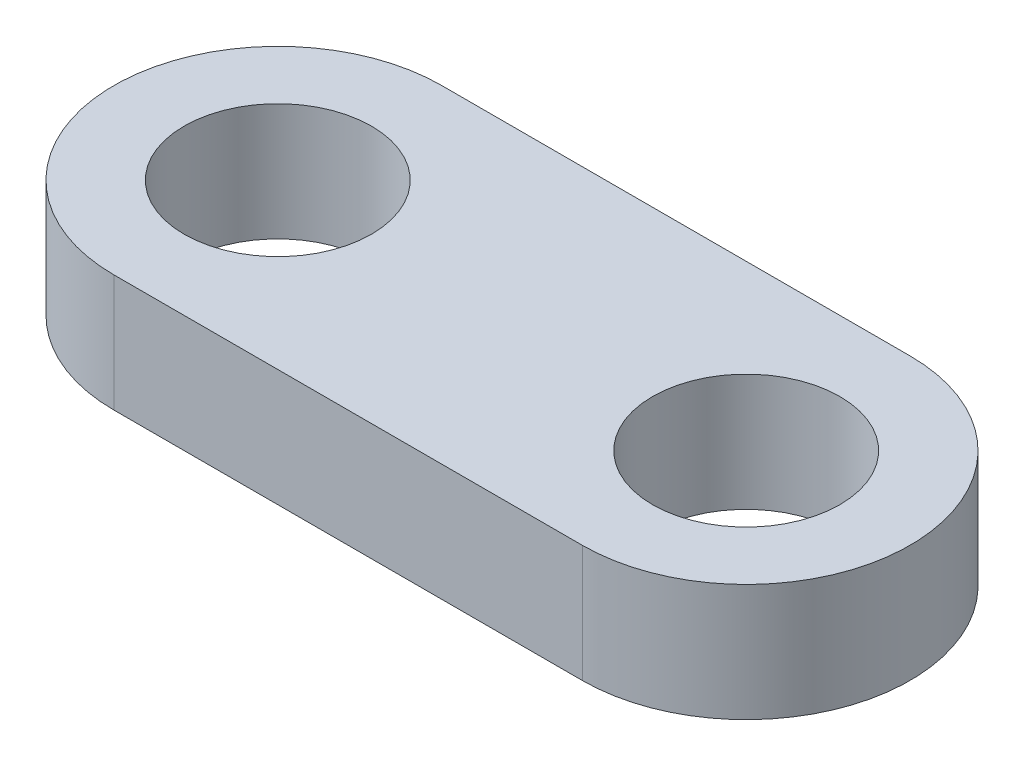
ISO-10303-21;
HEADER;
FILE_DESCRIPTION(('STEP AP214'),'2;1');
FILE_NAME('part.step','',(''),(''),'','','');
FILE_SCHEMA(('AUTOMOTIVE_DESIGN { 1 0 10303 214 1 1 1 1 }'));
ENDSEC;
DATA;
#1=APPLICATION_CONTEXT('core data for automotive mechanical design processes');
#2=APPLICATION_PROTOCOL_DEFINITION('international standard','automotive_design',2000,#1);
#3=PRODUCT_CONTEXT('',#1,'mechanical');
#4=PRODUCT('Part','Part','',(#3));
#5=PRODUCT_RELATED_PRODUCT_CATEGORY('part','',(#4));
#6=PRODUCT_DEFINITION_FORMATION('','',#4);
#7=PRODUCT_DEFINITION_CONTEXT('part definition',#1,'design');
#8=PRODUCT_DEFINITION('design','',#6,#7);
#9=PRODUCT_DEFINITION_SHAPE('','',#8);
#10=(LENGTH_UNIT() NAMED_UNIT(*) SI_UNIT(.MILLI.,.METRE.));
#11=(NAMED_UNIT(*) PLANE_ANGLE_UNIT() SI_UNIT($,.RADIAN.));
#12=(NAMED_UNIT(*) SI_UNIT($,.STERADIAN.) SOLID_ANGLE_UNIT());
#13=UNCERTAINTY_MEASURE_WITH_UNIT(LENGTH_MEASURE(1.E-05),#10,'distance_accuracy_value','');
#14=(GEOMETRIC_REPRESENTATION_CONTEXT(3) GLOBAL_UNCERTAINTY_ASSIGNED_CONTEXT((#13)) GLOBAL_UNIT_ASSIGNED_CONTEXT((#10,
#11,#12)) REPRESENTATION_CONTEXT('',''));
#15=CARTESIAN_POINT('',(0.,0.,0.));
#16=DIRECTION('',(0.,0.,1.));
#17=DIRECTION('',(1.,0.,0.));
#18=AXIS2_PLACEMENT_3D('',#15,#16,#17);
#19=CARTESIAN_POINT('',(-10.,5.,0.));
#20=DIRECTION('',(0.,1.,0.));
#21=DIRECTION('',(0.,0.,1.));
#22=AXIS2_PLACEMENT_3D('',#19,#20,#21);
#23=PLANE('',#22);
#24=CARTESIAN_POINT('',(10.,5.,0.));
#25=DIRECTION('',(0.,1.,0.));
#26=DIRECTION('',(0.,0.,1.));
#27=AXIS2_PLACEMENT_3D('',#24,#25,#26);
#28=CIRCLE('',#27,4.);
#29=CARTESIAN_POINT('',(10.,5.,4.));
#30=VERTEX_POINT('',#29);
#31=EDGE_CURVE('E100',#30,#30,#28,.T.);
#32=ORIENTED_EDGE('',*,*,#31,.F.);
#33=EDGE_LOOP('',(#32));
#34=FACE_BOUND('',#33,.T.);
#35=CARTESIAN_POINT('',(-10.,5.,0.));
#36=DIRECTION('',(0.,1.,0.));
#37=DIRECTION('',(0.,0.,1.));
#38=AXIS2_PLACEMENT_3D('',#35,#36,#37);
#39=CIRCLE('',#38,7.);
#40=CARTESIAN_POINT('',(-10.,5.,-7.));
#41=VERTEX_POINT('',#40);
#42=CARTESIAN_POINT('',(-10.,5.,7.));
#43=VERTEX_POINT('',#42);
#44=EDGE_CURVE('E85',#41,#43,#39,.T.);
#45=ORIENTED_EDGE('',*,*,#44,.T.);
#46=DIRECTION('',(1.,0.,0.));
#47=VECTOR('',#46,1.);
#48=CARTESIAN_POINT('',(-10.,5.,7.));
#49=LINE('',#48,#47);
#50=CARTESIAN_POINT('',(10.,5.,7.));
#51=VERTEX_POINT('',#50);
#52=EDGE_CURVE('E80',#43,#51,#49,.T.);
#53=ORIENTED_EDGE('',*,*,#52,.T.);
#54=CARTESIAN_POINT('',(10.,5.,0.));
#55=DIRECTION('',(0.,1.,0.));
#56=DIRECTION('',(0.,0.,1.));
#57=AXIS2_PLACEMENT_3D('',#54,#55,#56);
#58=CIRCLE('',#57,7.);
#59=CARTESIAN_POINT('',(10.,5.,-7.));
#60=VERTEX_POINT('',#59);
#61=EDGE_CURVE('E83',#51,#60,#58,.T.);
#62=ORIENTED_EDGE('',*,*,#61,.T.);
#63=DIRECTION('',(-1.,0.,0.));
#64=VECTOR('',#63,1.);
#65=CARTESIAN_POINT('',(-10.,5.,-7.));
#66=LINE('',#65,#64);
#67=EDGE_CURVE('E50',#60,#41,#66,.T.);
#68=ORIENTED_EDGE('',*,*,#67,.T.);
#69=EDGE_LOOP('',(#45,#53,#62,#68));
#70=FACE_BOUND('',#69,.T.);
#71=CARTESIAN_POINT('',(-10.,5.,0.));
#72=DIRECTION('',(0.,1.,0.));
#73=DIRECTION('',(0.,0.,1.));
#74=AXIS2_PLACEMENT_3D('',#71,#72,#73);
#75=CIRCLE('',#74,4.);
#76=CARTESIAN_POINT('',(-10.,5.,4.));
#77=VERTEX_POINT('',#76);
#78=EDGE_CURVE('E115',#77,#77,#75,.T.);
#79=ORIENTED_EDGE('',*,*,#78,.F.);
#80=EDGE_LOOP('',(#79));
#81=FACE_BOUND('',#80,.T.);
#82=ADVANCED_FACE('F33',(#34,#70,#81),#23,.T.);
#83=CARTESIAN_POINT('',(-10.,0.,0.));
#84=DIRECTION('',(0.,1.,0.));
#85=DIRECTION('',(0.,0.,1.));
#86=AXIS2_PLACEMENT_3D('',#83,#84,#85);
#87=PLANE('',#86);
#88=CARTESIAN_POINT('',(-10.,0.,0.));
#89=DIRECTION('',(0.,1.,0.));
#90=DIRECTION('',(0.,0.,1.));
#91=AXIS2_PLACEMENT_3D('',#88,#89,#90);
#92=CIRCLE('',#91,7.);
#93=CARTESIAN_POINT('',(-10.,0.,-7.));
#94=VERTEX_POINT('',#93);
#95=CARTESIAN_POINT('',(-10.,0.,7.));
#96=VERTEX_POINT('',#95);
#97=EDGE_CURVE('E97',#94,#96,#92,.T.);
#98=ORIENTED_EDGE('',*,*,#97,.F.);
#99=DIRECTION('',(-1.,0.,0.));
#100=VECTOR('',#99,1.);
#101=CARTESIAN_POINT('',(-10.,0.,-7.));
#102=LINE('',#101,#100);
#103=CARTESIAN_POINT('',(10.,0.,-7.));
#104=VERTEX_POINT('',#103);
#105=EDGE_CURVE('E73',#104,#94,#102,.T.);
#106=ORIENTED_EDGE('',*,*,#105,.F.);
#107=CARTESIAN_POINT('',(10.,0.,0.));
#108=DIRECTION('',(0.,1.,0.));
#109=DIRECTION('',(0.,0.,1.));
#110=AXIS2_PLACEMENT_3D('',#107,#108,#109);
#111=CIRCLE('',#110,7.);
#112=CARTESIAN_POINT('',(10.,0.,7.));
#113=VERTEX_POINT('',#112);
#114=EDGE_CURVE('E67',#113,#104,#111,.T.);
#115=ORIENTED_EDGE('',*,*,#114,.F.);
#116=DIRECTION('',(1.,0.,0.));
#117=VECTOR('',#116,1.);
#118=CARTESIAN_POINT('',(-10.,0.,7.));
#119=LINE('',#118,#117);
#120=EDGE_CURVE('E89',#96,#113,#119,.T.);
#121=ORIENTED_EDGE('',*,*,#120,.F.);
#122=EDGE_LOOP('',(#98,#106,#115,#121));
#123=FACE_BOUND('',#122,.T.);
#124=CARTESIAN_POINT('',(10.,0.,0.));
#125=DIRECTION('',(0.,1.,0.));
#126=DIRECTION('',(0.,0.,1.));
#127=AXIS2_PLACEMENT_3D('',#124,#125,#126);
#128=CIRCLE('',#127,4.);
#129=CARTESIAN_POINT('',(10.,0.,4.));
#130=VERTEX_POINT('',#129);
#131=EDGE_CURVE('E112',#130,#130,#128,.T.);
#132=ORIENTED_EDGE('',*,*,#131,.T.);
#133=EDGE_LOOP('',(#132));
#134=FACE_BOUND('',#133,.T.);
#135=CARTESIAN_POINT('',(-10.,0.,0.));
#136=DIRECTION('',(0.,1.,0.));
#137=DIRECTION('',(0.,0.,1.));
#138=AXIS2_PLACEMENT_3D('',#135,#136,#137);
#139=CIRCLE('',#138,4.);
#140=CARTESIAN_POINT('',(-10.,0.,4.));
#141=VERTEX_POINT('',#140);
#142=EDGE_CURVE('E118',#141,#141,#139,.T.);
#143=ORIENTED_EDGE('',*,*,#142,.T.);
#144=EDGE_LOOP('',(#143));
#145=FACE_BOUND('',#144,.T.);
#146=ADVANCED_FACE('F108',(#123,#134,#145),#87,.F.);
#147=CARTESIAN_POINT('',(-10.,5.,0.));
#148=DIRECTION('',(0.,-1.,0.));
#149=DIRECTION('',(0.,0.,-1.));
#150=AXIS2_PLACEMENT_3D('',#147,#148,#149);
#151=CYLINDRICAL_SURFACE('',#150,7.);
#152=ORIENTED_EDGE('',*,*,#97,.T.);
#153=DIRECTION('',(0.,-1.,0.));
#154=VECTOR('',#153,1.);
#155=CARTESIAN_POINT('',(-10.,5.,7.));
#156=LINE('',#155,#154);
#157=EDGE_CURVE('E11',#43,#96,#156,.T.);
#158=ORIENTED_EDGE('',*,*,#157,.F.);
#159=ORIENTED_EDGE('',*,*,#44,.F.);
#160=DIRECTION('',(0.,-1.,0.));
#161=VECTOR('',#160,1.);
#162=CARTESIAN_POINT('',(-10.,5.,-7.));
#163=LINE('',#162,#161);
#164=EDGE_CURVE('E93',#41,#94,#163,.T.);
#165=ORIENTED_EDGE('',*,*,#164,.T.);
#166=EDGE_LOOP('',(#152,#158,#159,#165));
#167=FACE_BOUND('',#166,.T.);
#168=ADVANCED_FACE('F35',(#167),#151,.T.);
#169=CARTESIAN_POINT('',(-10.,5.,7.));
#170=DIRECTION('',(0.,0.,-1.));
#171=DIRECTION('',(-1.,0.,0.));
#172=AXIS2_PLACEMENT_3D('',#169,#170,#171);
#173=PLANE('',#172);
#174=ORIENTED_EDGE('',*,*,#120,.T.);
#175=DIRECTION('',(0.,-1.,0.));
#176=VECTOR('',#175,1.);
#177=CARTESIAN_POINT('',(10.,5.,7.));
#178=LINE('',#177,#176);
#179=EDGE_CURVE('E42',#51,#113,#178,.T.);
#180=ORIENTED_EDGE('',*,*,#179,.F.);
#181=ORIENTED_EDGE('',*,*,#52,.F.);
#182=ORIENTED_EDGE('',*,*,#157,.T.);
#183=EDGE_LOOP('',(#174,#180,#181,#182));
#184=FACE_BOUND('',#183,.T.);
#185=ADVANCED_FACE('F88',(#184),#173,.F.);
#186=CARTESIAN_POINT('',(10.,5.,0.));
#187=DIRECTION('',(0.,-1.,0.));
#188=DIRECTION('',(0.,0.,-1.));
#189=AXIS2_PLACEMENT_3D('',#186,#187,#188);
#190=CYLINDRICAL_SURFACE('',#189,7.);
#191=ORIENTED_EDGE('',*,*,#114,.T.);
#192=DIRECTION('',(0.,-1.,0.));
#193=VECTOR('',#192,1.);
#194=CARTESIAN_POINT('',(10.,5.,-7.));
#195=LINE('',#194,#193);
#196=EDGE_CURVE('E90',#60,#104,#195,.T.);
#197=ORIENTED_EDGE('',*,*,#196,.F.);
#198=ORIENTED_EDGE('',*,*,#61,.F.);
#199=ORIENTED_EDGE('',*,*,#179,.T.);
#200=EDGE_LOOP('',(#191,#197,#198,#199));
#201=FACE_BOUND('',#200,.T.);
#202=ADVANCED_FACE('F91',(#201),#190,.T.);
#203=CARTESIAN_POINT('',(-10.,5.,-7.));
#204=DIRECTION('',(0.,0.,1.));
#205=DIRECTION('',(1.,0.,0.));
#206=AXIS2_PLACEMENT_3D('',#203,#204,#205);
#207=PLANE('',#206);
#208=ORIENTED_EDGE('',*,*,#105,.T.);
#209=ORIENTED_EDGE('',*,*,#164,.F.);
#210=ORIENTED_EDGE('',*,*,#67,.F.);
#211=ORIENTED_EDGE('',*,*,#196,.T.);
#212=EDGE_LOOP('',(#208,#209,#210,#211));
#213=FACE_BOUND('',#212,.T.);
#214=ADVANCED_FACE('F105',(#213),#207,.F.);
#215=CARTESIAN_POINT('',(10.,5.,0.));
#216=DIRECTION('',(0.,-1.,0.));
#217=DIRECTION('',(0.,0.,-1.));
#218=AXIS2_PLACEMENT_3D('',#215,#216,#217);
#219=CYLINDRICAL_SURFACE('',#218,4.);
#220=ORIENTED_EDGE('',*,*,#31,.T.);
#221=EDGE_LOOP('',(#220));
#222=FACE_BOUND('',#221,.T.);
#223=ORIENTED_EDGE('',*,*,#131,.F.);
#224=EDGE_LOOP('',(#223));
#225=FACE_BOUND('',#224,.T.);
#226=ADVANCED_FACE('F135',(#222,#225),#219,.F.);
#227=CARTESIAN_POINT('',(-10.,5.,0.));
#228=DIRECTION('',(0.,-1.,0.));
#229=DIRECTION('',(0.,0.,-1.));
#230=AXIS2_PLACEMENT_3D('',#227,#228,#229);
#231=CYLINDRICAL_SURFACE('',#230,4.);
#232=ORIENTED_EDGE('',*,*,#78,.T.);
#233=EDGE_LOOP('',(#232));
#234=FACE_BOUND('',#233,.T.);
#235=ORIENTED_EDGE('',*,*,#142,.F.);
#236=EDGE_LOOP('',(#235));
#237=FACE_BOUND('',#236,.T.);
#238=ADVANCED_FACE('F124',(#234,#237),#231,.F.);
#239=CLOSED_SHELL('',(#82,#146,#168,#185,#202,#214,#226,#238));
#240=MANIFOLD_SOLID_BREP('B2',#239);
#241=ADVANCED_BREP_SHAPE_REPRESENTATION('',(#18,#240),#14);
#242=SHAPE_DEFINITION_REPRESENTATION(#9,#241);
ENDSEC;
END-ISO-10303-21;
